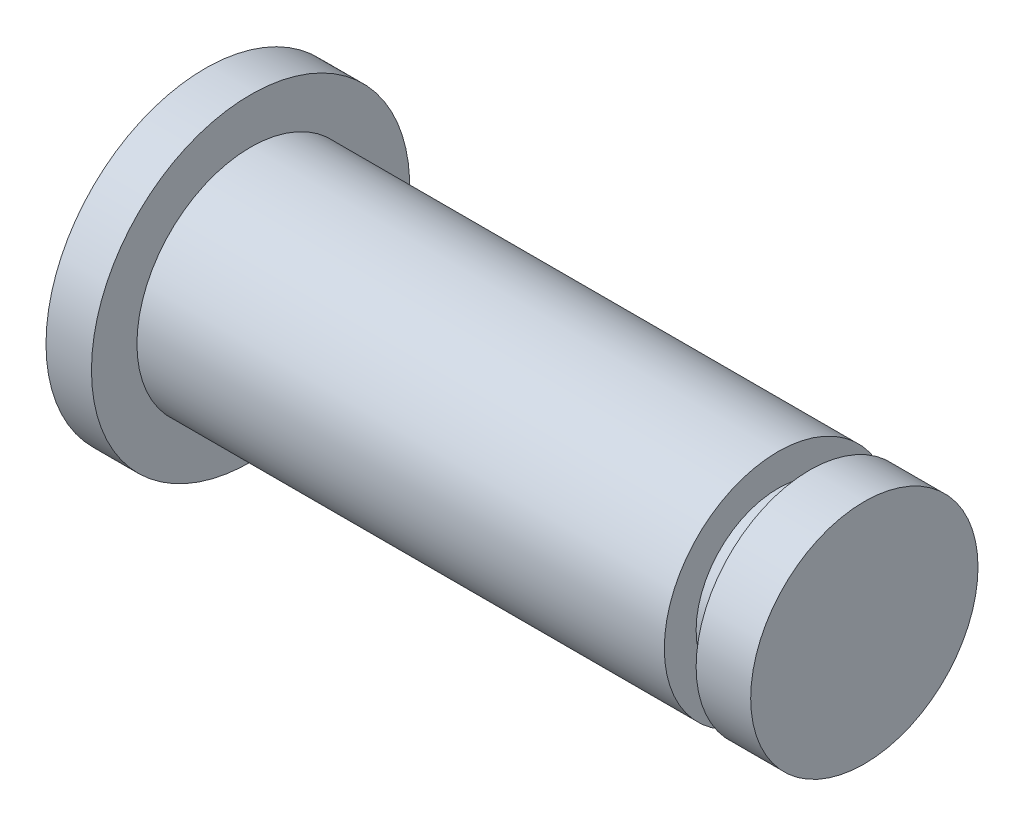
ISO-10303-21;
HEADER;
FILE_DESCRIPTION(('STEP AP214'),'2;1');
FILE_NAME('part.step','',(''),(''),'','','');
FILE_SCHEMA(('AUTOMOTIVE_DESIGN { 1 0 10303 214 1 1 1 1 }'));
ENDSEC;
DATA;
#1=APPLICATION_CONTEXT('core data for automotive mechanical design processes');
#2=APPLICATION_PROTOCOL_DEFINITION('international standard','automotive_design',2000,#1);
#3=PRODUCT_CONTEXT('',#1,'mechanical');
#4=PRODUCT('Part','Part','',(#3));
#5=PRODUCT_RELATED_PRODUCT_CATEGORY('part','',(#4));
#6=PRODUCT_DEFINITION_FORMATION('','',#4);
#7=PRODUCT_DEFINITION_CONTEXT('part definition',#1,'design');
#8=PRODUCT_DEFINITION('design','',#6,#7);
#9=PRODUCT_DEFINITION_SHAPE('','',#8);
#10=(LENGTH_UNIT() NAMED_UNIT(*) SI_UNIT(.MILLI.,.METRE.));
#11=(NAMED_UNIT(*) PLANE_ANGLE_UNIT() SI_UNIT($,.RADIAN.));
#12=(NAMED_UNIT(*) SI_UNIT($,.STERADIAN.) SOLID_ANGLE_UNIT());
#13=UNCERTAINTY_MEASURE_WITH_UNIT(LENGTH_MEASURE(1.E-05),#10,'distance_accuracy_value','');
#14=(GEOMETRIC_REPRESENTATION_CONTEXT(3) GLOBAL_UNCERTAINTY_ASSIGNED_CONTEXT((#13)) GLOBAL_UNIT_ASSIGNED_CONTEXT((#10,
#11,#12)) REPRESENTATION_CONTEXT('',''));
#15=CARTESIAN_POINT('',(0.,0.,0.));
#16=DIRECTION('',(0.,0.,1.));
#17=DIRECTION('',(1.,0.,0.));
#18=AXIS2_PLACEMENT_3D('',#15,#16,#17);
#19=CARTESIAN_POINT('',(0.,0.,0.));
#20=DIRECTION('',(1.,0.,0.));
#21=DIRECTION('',(0.,0.,-1.));
#22=AXIS2_PLACEMENT_3D('',#19,#20,#21);
#23=PLANE('',#22);
#24=CARTESIAN_POINT('',(0.,0.,0.));
#25=DIRECTION('',(-1.,0.,0.));
#26=DIRECTION('',(0.,0.,1.));
#27=AXIS2_PLACEMENT_3D('',#24,#25,#26);
#28=CIRCLE('',#27,35.);
#29=CARTESIAN_POINT('',(0.,0.,35.));
#30=VERTEX_POINT('',#29);
#31=EDGE_CURVE('E10',#30,#30,#28,.T.);
#32=ORIENTED_EDGE('',*,*,#31,.T.);
#33=EDGE_LOOP('',(#32));
#34=FACE_BOUND('',#33,.T.);
#35=ADVANCED_FACE('F30',(#34),#23,.F.);
#36=CARTESIAN_POINT('',(0.,0.,0.));
#37=DIRECTION('',(-1.,0.,0.));
#38=DIRECTION('',(0.,0.,1.));
#39=AXIS2_PLACEMENT_3D('',#36,#37,#38);
#40=CYLINDRICAL_SURFACE('',#39,35.);
#41=ORIENTED_EDGE('',*,*,#31,.F.);
#42=EDGE_LOOP('',(#41));
#43=FACE_BOUND('',#42,.T.);
#44=CARTESIAN_POINT('',(10.,0.,0.));
#45=DIRECTION('',(-1.,0.,0.));
#46=DIRECTION('',(0.,0.,1.));
#47=AXIS2_PLACEMENT_3D('',#44,#45,#46);
#48=CIRCLE('',#47,35.);
#49=CARTESIAN_POINT('',(10.,0.,35.));
#50=VERTEX_POINT('',#49);
#51=EDGE_CURVE('E36',#50,#50,#48,.T.);
#52=ORIENTED_EDGE('',*,*,#51,.T.);
#53=EDGE_LOOP('',(#52));
#54=FACE_BOUND('',#53,.T.);
#55=ADVANCED_FACE('F74',(#43,#54),#40,.T.);
#56=CARTESIAN_POINT('',(10.,35.,0.));
#57=DIRECTION('',(-1.,0.,0.));
#58=DIRECTION('',(0.,0.,1.));
#59=AXIS2_PLACEMENT_3D('',#56,#57,#58);
#60=PLANE('',#59);
#61=ORIENTED_EDGE('',*,*,#51,.F.);
#62=EDGE_LOOP('',(#61));
#63=FACE_BOUND('',#62,.T.);
#64=CARTESIAN_POINT('',(10.,0.,0.));
#65=DIRECTION('',(-1.,0.,0.));
#66=DIRECTION('',(0.,0.,1.));
#67=AXIS2_PLACEMENT_3D('',#64,#65,#66);
#68=CIRCLE('',#67,25.);
#69=CARTESIAN_POINT('',(10.,0.,25.));
#70=VERTEX_POINT('',#69);
#71=EDGE_CURVE('E40',#70,#70,#68,.T.);
#72=ORIENTED_EDGE('',*,*,#71,.T.);
#73=EDGE_LOOP('',(#72));
#74=FACE_BOUND('',#73,.T.);
#75=ADVANCED_FACE('F78',(#63,#74),#60,.F.);
#76=CARTESIAN_POINT('',(0.,0.,0.));
#77=DIRECTION('',(-1.,0.,0.));
#78=DIRECTION('',(0.,0.,1.));
#79=AXIS2_PLACEMENT_3D('',#76,#77,#78);
#80=CYLINDRICAL_SURFACE('',#79,25.);
#81=ORIENTED_EDGE('',*,*,#71,.F.);
#82=EDGE_LOOP('',(#81));
#83=FACE_BOUND('',#82,.T.);
#84=CARTESIAN_POINT('',(126.,0.,0.));
#85=DIRECTION('',(-1.,0.,0.));
#86=DIRECTION('',(0.,0.,1.));
#87=AXIS2_PLACEMENT_3D('',#84,#85,#86);
#88=CIRCLE('',#87,25.);
#89=CARTESIAN_POINT('',(126.,0.,25.));
#90=VERTEX_POINT('',#89);
#91=EDGE_CURVE('E44',#90,#90,#88,.T.);
#92=ORIENTED_EDGE('',*,*,#91,.T.);
#93=EDGE_LOOP('',(#92));
#94=FACE_BOUND('',#93,.T.);
#95=ADVANCED_FACE('F83',(#83,#94),#80,.T.);
#96=CARTESIAN_POINT('',(126.,25.,0.));
#97=DIRECTION('',(-1.,0.,0.));
#98=DIRECTION('',(0.,0.,1.));
#99=AXIS2_PLACEMENT_3D('',#96,#97,#98);
#100=PLANE('',#99);
#101=ORIENTED_EDGE('',*,*,#91,.F.);
#102=EDGE_LOOP('',(#101));
#103=FACE_BOUND('',#102,.T.);
#104=CARTESIAN_POINT('',(126.,0.,0.));
#105=DIRECTION('',(-1.,0.,0.));
#106=DIRECTION('',(0.,0.,1.));
#107=AXIS2_PLACEMENT_3D('',#104,#105,#106);
#108=CIRCLE('',#107,18.);
#109=CARTESIAN_POINT('',(126.,0.,18.));
#110=VERTEX_POINT('',#109);
#111=EDGE_CURVE('E49',#110,#110,#108,.T.);
#112=ORIENTED_EDGE('',*,*,#111,.T.);
#113=EDGE_LOOP('',(#112));
#114=FACE_BOUND('',#113,.T.);
#115=ADVANCED_FACE('F89',(#103,#114),#100,.F.);
#116=CARTESIAN_POINT('',(0.,0.,0.));
#117=DIRECTION('',(-1.,0.,0.));
#118=DIRECTION('',(0.,0.,1.));
#119=AXIS2_PLACEMENT_3D('',#116,#117,#118);
#120=CYLINDRICAL_SURFACE('',#119,18.);
#121=ORIENTED_EDGE('',*,*,#111,.F.);
#122=EDGE_LOOP('',(#121));
#123=FACE_BOUND('',#122,.T.);
#124=CARTESIAN_POINT('',(133.,0.,0.));
#125=DIRECTION('',(-1.,0.,0.));
#126=DIRECTION('',(0.,0.,1.));
#127=AXIS2_PLACEMENT_3D('',#124,#125,#126);
#128=CIRCLE('',#127,18.);
#129=CARTESIAN_POINT('',(133.,0.,18.));
#130=VERTEX_POINT('',#129);
#131=EDGE_CURVE('E52',#130,#130,#128,.T.);
#132=ORIENTED_EDGE('',*,*,#131,.T.);
#133=EDGE_LOOP('',(#132));
#134=FACE_BOUND('',#133,.T.);
#135=ADVANCED_FACE('F93',(#123,#134),#120,.T.);
#136=CARTESIAN_POINT('',(133.,18.,0.));
#137=DIRECTION('',(1.,0.,0.));
#138=DIRECTION('',(0.,0.,-1.));
#139=AXIS2_PLACEMENT_3D('',#136,#137,#138);
#140=PLANE('',#139);
#141=ORIENTED_EDGE('',*,*,#131,.F.);
#142=EDGE_LOOP('',(#141));
#143=FACE_BOUND('',#142,.T.);
#144=CARTESIAN_POINT('',(133.,0.,0.));
#145=DIRECTION('',(-1.,0.,0.));
#146=DIRECTION('',(0.,0.,1.));
#147=AXIS2_PLACEMENT_3D('',#144,#145,#146);
#148=CIRCLE('',#147,25.);
#149=CARTESIAN_POINT('',(133.,0.,25.));
#150=VERTEX_POINT('',#149);
#151=EDGE_CURVE('E55',#150,#150,#148,.T.);
#152=ORIENTED_EDGE('',*,*,#151,.T.);
#153=EDGE_LOOP('',(#152));
#154=FACE_BOUND('',#153,.T.);
#155=ADVANCED_FACE('F70',(#143,#154),#140,.F.);
#156=CARTESIAN_POINT('',(0.,0.,0.));
#157=DIRECTION('',(-1.,0.,0.));
#158=DIRECTION('',(0.,0.,1.));
#159=AXIS2_PLACEMENT_3D('',#156,#157,#158);
#160=CYLINDRICAL_SURFACE('',#159,25.);
#161=ORIENTED_EDGE('',*,*,#151,.F.);
#162=EDGE_LOOP('',(#161));
#163=FACE_BOUND('',#162,.T.);
#164=CARTESIAN_POINT('',(145.,0.,0.));
#165=DIRECTION('',(-1.,0.,0.));
#166=DIRECTION('',(0.,0.,1.));
#167=AXIS2_PLACEMENT_3D('',#164,#165,#166);
#168=CIRCLE('',#167,25.);
#169=CARTESIAN_POINT('',(145.,0.,25.));
#170=VERTEX_POINT('',#169);
#171=EDGE_CURVE('E58',#170,#170,#168,.T.);
#172=ORIENTED_EDGE('',*,*,#171,.T.);
#173=EDGE_LOOP('',(#172));
#174=FACE_BOUND('',#173,.T.);
#175=ADVANCED_FACE('F62',(#163,#174),#160,.T.);
#176=CARTESIAN_POINT('',(145.,25.,0.));
#177=DIRECTION('',(-1.,0.,0.));
#178=DIRECTION('',(0.,0.,1.));
#179=AXIS2_PLACEMENT_3D('',#176,#177,#178);
#180=PLANE('',#179);
#181=ORIENTED_EDGE('',*,*,#171,.F.);
#182=EDGE_LOOP('',(#181));
#183=FACE_BOUND('',#182,.T.);
#184=ADVANCED_FACE('F64',(#183),#180,.F.);
#185=CLOSED_SHELL('',(#35,#55,#75,#95,#115,#135,#155,#175,#184));
#186=MANIFOLD_SOLID_BREP('B2',#185);
#187=ADVANCED_BREP_SHAPE_REPRESENTATION('',(#18,#186),#14);
#188=SHAPE_DEFINITION_REPRESENTATION(#9,#187);
ENDSEC;
END-ISO-10303-21;
